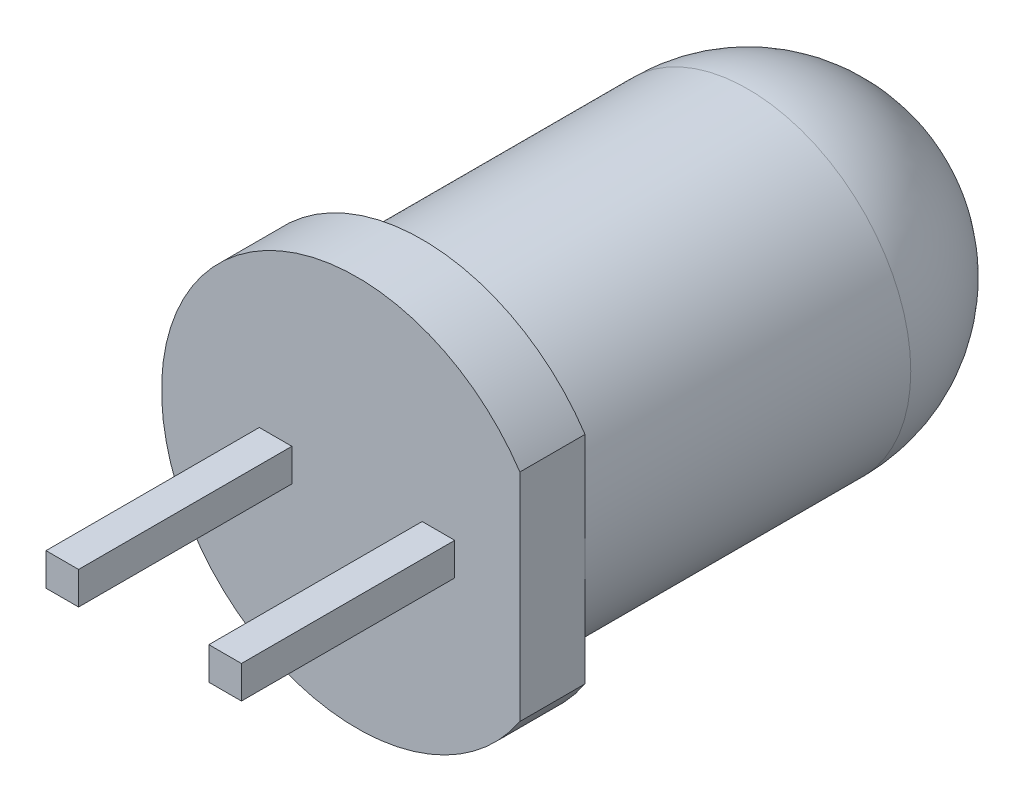
ISO-10303-21;
HEADER;
FILE_DESCRIPTION(('STEP AP214'),'2;1');
FILE_NAME('part.step','',(''),(''),'','','');
FILE_SCHEMA(('AUTOMOTIVE_DESIGN { 1 0 10303 214 1 1 1 1 }'));
ENDSEC;
DATA;
#1=APPLICATION_CONTEXT('core data for automotive mechanical design processes');
#2=APPLICATION_PROTOCOL_DEFINITION('international standard','automotive_design',2000,#1);
#3=PRODUCT_CONTEXT('',#1,'mechanical');
#4=PRODUCT('Part','Part','',(#3));
#5=PRODUCT_RELATED_PRODUCT_CATEGORY('part','',(#4));
#6=PRODUCT_DEFINITION_FORMATION('','',#4);
#7=PRODUCT_DEFINITION_CONTEXT('part definition',#1,'design');
#8=PRODUCT_DEFINITION('design','',#6,#7);
#9=PRODUCT_DEFINITION_SHAPE('','',#8);
#10=(LENGTH_UNIT() NAMED_UNIT(*) SI_UNIT(.MILLI.,.METRE.));
#11=(NAMED_UNIT(*) PLANE_ANGLE_UNIT() SI_UNIT($,.RADIAN.));
#12=(NAMED_UNIT(*) SI_UNIT($,.STERADIAN.) SOLID_ANGLE_UNIT());
#13=UNCERTAINTY_MEASURE_WITH_UNIT(LENGTH_MEASURE(1.E-05),#10,'distance_accuracy_value','');
#14=(GEOMETRIC_REPRESENTATION_CONTEXT(3) GLOBAL_UNCERTAINTY_ASSIGNED_CONTEXT((#13)) GLOBAL_UNIT_ASSIGNED_CONTEXT((#10,
#11,#12)) REPRESENTATION_CONTEXT('',''));
#15=CARTESIAN_POINT('',(0.,0.,0.));
#16=DIRECTION('',(0.,0.,1.));
#17=DIRECTION('',(1.,0.,0.));
#18=AXIS2_PLACEMENT_3D('',#15,#16,#17);
#19=CARTESIAN_POINT('',(0.,0.,-4.77161579796497));
#20=DIRECTION('',(0.,0.,-1.));
#21=DIRECTION('',(-1.,0.,0.));
#22=AXIS2_PLACEMENT_3D('',#19,#20,#21);
#23=SPHERICAL_SURFACE('',#22,2.5);
#24=CARTESIAN_POINT('',(0.,0.,-4.77161579796497));
#25=DIRECTION('',(0.,0.,-1.));
#26=DIRECTION('',(-1.,0.,0.));
#27=AXIS2_PLACEMENT_3D('',#24,#25,#26);
#28=CIRCLE('',#27,2.5);
#29=CARTESIAN_POINT('',(-2.5,0.,-4.77161579796497));
#30=VERTEX_POINT('',#29);
#31=EDGE_CURVE('E154',#30,#30,#28,.T.);
#32=ORIENTED_EDGE('',*,*,#31,.T.);
#33=EDGE_LOOP('',(#32));
#34=FACE_BOUND('',#33,.T.);
#35=ADVANCED_FACE('F32',(#34),#23,.T.);
#36=CARTESIAN_POINT('',(0.,0.,-8.02238805970151));
#37=DIRECTION('',(0.,0.,-1.));
#38=DIRECTION('',(-1.,0.,0.));
#39=AXIS2_PLACEMENT_3D('',#36,#37,#38);
#40=CYLINDRICAL_SURFACE('',#39,2.5);
#41=CARTESIAN_POINT('',(0.,0.,0.228384202035027));
#42=DIRECTION('',(0.,0.,-1.));
#43=DIRECTION('',(-1.,0.,0.));
#44=AXIS2_PLACEMENT_3D('',#41,#42,#43);
#45=CIRCLE('',#44,2.5);
#46=CARTESIAN_POINT('',(2.5,0.,0.228384202035027));
#47=VERTEX_POINT('',#46);
#48=EDGE_CURVE('E151',#47,#47,#45,.T.);
#49=ORIENTED_EDGE('',*,*,#48,.T.);
#50=EDGE_LOOP('',(#49));
#51=FACE_BOUND('',#50,.T.);
#52=ORIENTED_EDGE('',*,*,#31,.F.);
#53=EDGE_LOOP('',(#52));
#54=FACE_BOUND('',#53,.T.);
#55=ADVANCED_FACE('F242',(#51,#54),#40,.T.);
#56=CARTESIAN_POINT('',(-2.5,0.,0.228384202035027));
#57=DIRECTION('',(0.,0.,-1.));
#58=DIRECTION('',(-1.,0.,0.));
#59=AXIS2_PLACEMENT_3D('',#56,#57,#58);
#60=PLANE('',#59);
#61=DIRECTION('',(0.,1.,0.));
#62=VECTOR('',#61,1.);
#63=CARTESIAN_POINT('',(2.5,0.,0.228384202035027));
#64=LINE('',#63,#62);
#65=CARTESIAN_POINT('',(2.5,-1.6583123951777,0.228384202035027));
#66=VERTEX_POINT('',#65);
#67=EDGE_CURVE('E131',#66,#47,#64,.T.);
#68=ORIENTED_EDGE('',*,*,#67,.F.);
#69=CARTESIAN_POINT('',(0.,0.,0.228384202035027));
#70=DIRECTION('',(0.,0.,-1.));
#71=DIRECTION('',(-1.,0.,0.));
#72=AXIS2_PLACEMENT_3D('',#69,#70,#71);
#73=CIRCLE('',#72,3.);
#74=CARTESIAN_POINT('',(2.5,1.6583123951777,0.228384202035027));
#75=VERTEX_POINT('',#74);
#76=EDGE_CURVE('E148',#66,#75,#73,.T.);
#77=ORIENTED_EDGE('',*,*,#76,.T.);
#78=EDGE_CURVE('E215',#47,#75,#64,.T.);
#79=ORIENTED_EDGE('',*,*,#78,.F.);
#80=ORIENTED_EDGE('',*,*,#48,.F.);
#81=EDGE_LOOP('',(#68,#77,#79,#80));
#82=FACE_BOUND('',#81,.T.);
#83=ADVANCED_FACE('F247',(#82),#60,.T.);
#84=CARTESIAN_POINT('',(0.,0.,-8.02238805970151));
#85=DIRECTION('',(0.,0.,-1.));
#86=DIRECTION('',(-1.,0.,0.));
#87=AXIS2_PLACEMENT_3D('',#84,#85,#86);
#88=CYLINDRICAL_SURFACE('',#87,3.);
#89=DIRECTION('',(0.,0.,-1.));
#90=VECTOR('',#89,1.);
#91=CARTESIAN_POINT('',(2.5,1.6583123951777,-8.02238805970151));
#92=LINE('',#91,#90);
#93=CARTESIAN_POINT('',(2.5,1.6583123951777,1.22838420203503));
#94=VERTEX_POINT('',#93);
#95=EDGE_CURVE('E182',#75,#94,#92,.F.);
#96=ORIENTED_EDGE('',*,*,#95,.F.);
#97=ORIENTED_EDGE('',*,*,#76,.F.);
#98=DIRECTION('',(0.,0.,-1.));
#99=VECTOR('',#98,1.);
#100=CARTESIAN_POINT('',(2.5,-1.6583123951777,-8.02238805970151));
#101=LINE('',#100,#99);
#102=CARTESIAN_POINT('',(2.5,-1.6583123951777,1.22838420203503));
#103=VERTEX_POINT('',#102);
#104=EDGE_CURVE('E179',#103,#66,#101,.T.);
#105=ORIENTED_EDGE('',*,*,#104,.F.);
#106=CARTESIAN_POINT('',(0.,0.,1.22838420203503));
#107=DIRECTION('',(0.,0.,-1.));
#108=DIRECTION('',(-1.,0.,0.));
#109=AXIS2_PLACEMENT_3D('',#106,#107,#108);
#110=CIRCLE('',#109,3.);
#111=EDGE_CURVE('E141',#103,#94,#110,.T.);
#112=ORIENTED_EDGE('',*,*,#111,.T.);
#113=EDGE_LOOP('',(#96,#97,#105,#112));
#114=FACE_BOUND('',#113,.T.);
#115=ADVANCED_FACE('F187',(#114),#88,.T.);
#116=CARTESIAN_POINT('',(0.,0.,1.22838420203503));
#117=DIRECTION('',(0.,0.,1.));
#118=DIRECTION('',(1.,0.,0.));
#119=AXIS2_PLACEMENT_3D('',#116,#117,#118);
#120=PLANE('',#119);
#121=DIRECTION('',(0.,-1.,0.));
#122=VECTOR('',#121,1.);
#123=CARTESIAN_POINT('',(2.5,0.,1.22838420203503));
#124=LINE('',#123,#122);
#125=EDGE_CURVE('E39',#94,#103,#124,.T.);
#126=ORIENTED_EDGE('',*,*,#125,.F.);
#127=ORIENTED_EDGE('',*,*,#111,.F.);
#128=EDGE_LOOP('',(#126,#127));
#129=FACE_BOUND('',#128,.T.);
#130=DIRECTION('',(-1.,0.,0.));
#131=VECTOR('',#130,1.);
#132=CARTESIAN_POINT('',(0.,0.25,1.22838420203503));
#133=LINE('',#132,#131);
#134=CARTESIAN_POINT('',(1.5,0.25,1.22838420203503));
#135=VERTEX_POINT('',#134);
#136=CARTESIAN_POINT('',(1.,0.25,1.22838420203503));
#137=VERTEX_POINT('',#136);
#138=EDGE_CURVE('E174',#135,#137,#133,.T.);
#139=ORIENTED_EDGE('',*,*,#138,.F.);
#140=DIRECTION('',(0.,-1.,0.));
#141=VECTOR('',#140,1.);
#142=CARTESIAN_POINT('',(1.5,0.,1.22838420203503));
#143=LINE('',#142,#141);
#144=CARTESIAN_POINT('',(1.5,-0.25,1.22838420203503));
#145=VERTEX_POINT('',#144);
#146=EDGE_CURVE('E169',#135,#145,#143,.T.);
#147=ORIENTED_EDGE('',*,*,#146,.T.);
#148=DIRECTION('',(-1.,0.,0.));
#149=VECTOR('',#148,1.);
#150=CARTESIAN_POINT('',(0.,-0.25,1.22838420203503));
#151=LINE('',#150,#149);
#152=CARTESIAN_POINT('',(1.,-0.25,1.22838420203503));
#153=VERTEX_POINT('',#152);
#154=EDGE_CURVE('E124',#145,#153,#151,.T.);
#155=ORIENTED_EDGE('',*,*,#154,.T.);
#156=DIRECTION('',(0.,1.,0.));
#157=VECTOR('',#156,1.);
#158=CARTESIAN_POINT('',(1.,0.,1.22838420203503));
#159=LINE('',#158,#157);
#160=EDGE_CURVE('E171',#153,#137,#159,.T.);
#161=ORIENTED_EDGE('',*,*,#160,.T.);
#162=EDGE_LOOP('',(#139,#147,#155,#161));
#163=FACE_BOUND('',#162,.T.);
#164=DIRECTION('',(-1.,0.,0.));
#165=VECTOR('',#164,1.);
#166=CARTESIAN_POINT('',(0.,0.25,1.22838420203503));
#167=LINE('',#166,#165);
#168=CARTESIAN_POINT('',(-1.,0.25,1.22838420203503));
#169=VERTEX_POINT('',#168);
#170=CARTESIAN_POINT('',(-1.5,0.25,1.22838420203503));
#171=VERTEX_POINT('',#170);
#172=EDGE_CURVE('E166',#169,#171,#167,.T.);
#173=ORIENTED_EDGE('',*,*,#172,.F.);
#174=DIRECTION('',(0.,-1.,0.));
#175=VECTOR('',#174,1.);
#176=CARTESIAN_POINT('',(-1.,0.,1.22838420203503));
#177=LINE('',#176,#175);
#178=CARTESIAN_POINT('',(-1.,-0.25,1.22838420203503));
#179=VERTEX_POINT('',#178);
#180=EDGE_CURVE('E160',#169,#179,#177,.T.);
#181=ORIENTED_EDGE('',*,*,#180,.T.);
#182=DIRECTION('',(-1.,0.,0.));
#183=VECTOR('',#182,1.);
#184=CARTESIAN_POINT('',(0.,-0.25,1.22838420203503));
#185=LINE('',#184,#183);
#186=CARTESIAN_POINT('',(-1.5,-0.25,1.22838420203503));
#187=VERTEX_POINT('',#186);
#188=EDGE_CURVE('E157',#179,#187,#185,.T.);
#189=ORIENTED_EDGE('',*,*,#188,.T.);
#190=DIRECTION('',(0.,1.,0.));
#191=VECTOR('',#190,1.);
#192=CARTESIAN_POINT('',(-1.5,0.,1.22838420203503));
#193=LINE('',#192,#191);
#194=EDGE_CURVE('E163',#187,#171,#193,.T.);
#195=ORIENTED_EDGE('',*,*,#194,.T.);
#196=EDGE_LOOP('',(#173,#181,#189,#195));
#197=FACE_BOUND('',#196,.T.);
#198=ADVANCED_FACE('F190',(#129,#163,#197),#120,.T.);
#199=CARTESIAN_POINT('',(-1.5,0.25,0.228384202035026));
#200=DIRECTION('',(1.,0.,0.));
#201=DIRECTION('',(0.,0.,-1.));
#202=AXIS2_PLACEMENT_3D('',#199,#200,#201);
#203=PLANE('',#202);
#204=DIRECTION('',(0.,0.,1.));
#205=VECTOR('',#204,1.);
#206=CARTESIAN_POINT('',(-1.5,-0.25,0.228384202035026));
#207=LINE('',#206,#205);
#208=CARTESIAN_POINT('',(-1.5,-0.25,4.50232179039273));
#209=VERTEX_POINT('',#208);
#210=EDGE_CURVE('E142',#187,#209,#207,.T.);
#211=ORIENTED_EDGE('',*,*,#210,.T.);
#212=DIRECTION('',(0.,1.,0.));
#213=VECTOR('',#212,1.);
#214=CARTESIAN_POINT('',(-1.5,0.25,4.50232179039273));
#215=LINE('',#214,#213);
#216=CARTESIAN_POINT('',(-1.5,0.25,4.50232179039273));
#217=VERTEX_POINT('',#216);
#218=EDGE_CURVE('E46',#209,#217,#215,.T.);
#219=ORIENTED_EDGE('',*,*,#218,.T.);
#220=DIRECTION('',(0.,0.,1.));
#221=VECTOR('',#220,1.);
#222=CARTESIAN_POINT('',(-1.5,0.25,0.228384202035026));
#223=LINE('',#222,#221);
#224=EDGE_CURVE('E135',#171,#217,#223,.T.);
#225=ORIENTED_EDGE('',*,*,#224,.F.);
#226=ORIENTED_EDGE('',*,*,#194,.F.);
#227=EDGE_LOOP('',(#211,#219,#225,#226));
#228=FACE_BOUND('',#227,.T.);
#229=ADVANCED_FACE('F193',(#228),#203,.F.);
#230=CARTESIAN_POINT('',(-1.,0.25,0.228384202035026));
#231=DIRECTION('',(-1.,0.,0.));
#232=DIRECTION('',(0.,0.,1.));
#233=AXIS2_PLACEMENT_3D('',#230,#231,#232);
#234=PLANE('',#233);
#235=DIRECTION('',(0.,0.,-1.));
#236=VECTOR('',#235,1.);
#237=CARTESIAN_POINT('',(-1.,0.25,0.228384202035026));
#238=LINE('',#237,#236);
#239=CARTESIAN_POINT('',(-0.999999999999999,0.25,4.50232179039273));
#240=VERTEX_POINT('',#239);
#241=EDGE_CURVE('E138',#240,#169,#238,.T.);
#242=ORIENTED_EDGE('',*,*,#241,.F.);
#243=DIRECTION('',(0.,-1.,0.));
#244=VECTOR('',#243,1.);
#245=CARTESIAN_POINT('',(-0.999999999999999,0.25,4.50232179039273));
#246=LINE('',#245,#244);
#247=CARTESIAN_POINT('',(-0.999999999999996,-0.25,4.50232179039273));
#248=VERTEX_POINT('',#247);
#249=EDGE_CURVE('E206',#240,#248,#246,.T.);
#250=ORIENTED_EDGE('',*,*,#249,.T.);
#251=DIRECTION('',(0.,0.,-1.));
#252=VECTOR('',#251,1.);
#253=CARTESIAN_POINT('',(-1.,-0.25,0.228384202035026));
#254=LINE('',#253,#252);
#255=EDGE_CURVE('E139',#248,#179,#254,.T.);
#256=ORIENTED_EDGE('',*,*,#255,.T.);
#257=ORIENTED_EDGE('',*,*,#180,.F.);
#258=EDGE_LOOP('',(#242,#250,#256,#257));
#259=FACE_BOUND('',#258,.T.);
#260=ADVANCED_FACE('F231',(#259),#234,.F.);
#261=CARTESIAN_POINT('',(0.,0.25,0.));
#262=DIRECTION('',(0.,1.,0.));
#263=DIRECTION('',(0.,0.,1.));
#264=AXIS2_PLACEMENT_3D('',#261,#262,#263);
#265=PLANE('',#264);
#266=DIRECTION('',(-1.,0.,0.));
#267=VECTOR('',#266,1.);
#268=CARTESIAN_POINT('',(0.,0.25,4.50232179039273));
#269=LINE('',#268,#267);
#270=EDGE_CURVE('E188',#240,#217,#269,.T.);
#271=ORIENTED_EDGE('',*,*,#270,.F.);
#272=ORIENTED_EDGE('',*,*,#241,.T.);
#273=ORIENTED_EDGE('',*,*,#172,.T.);
#274=ORIENTED_EDGE('',*,*,#224,.T.);
#275=EDGE_LOOP('',(#271,#272,#273,#274));
#276=FACE_BOUND('',#275,.T.);
#277=ADVANCED_FACE('F203',(#276),#265,.T.);
#278=CARTESIAN_POINT('',(0.,-0.25,0.));
#279=DIRECTION('',(0.,1.,0.));
#280=DIRECTION('',(0.,0.,1.));
#281=AXIS2_PLACEMENT_3D('',#278,#279,#280);
#282=PLANE('',#281);
#283=ORIENTED_EDGE('',*,*,#255,.F.);
#284=DIRECTION('',(-1.,0.,0.));
#285=VECTOR('',#284,1.);
#286=CARTESIAN_POINT('',(0.,-0.25,4.50232179039273));
#287=LINE('',#286,#285);
#288=EDGE_CURVE('E210',#248,#209,#287,.T.);
#289=ORIENTED_EDGE('',*,*,#288,.T.);
#290=ORIENTED_EDGE('',*,*,#210,.F.);
#291=ORIENTED_EDGE('',*,*,#188,.F.);
#292=EDGE_LOOP('',(#283,#289,#290,#291));
#293=FACE_BOUND('',#292,.T.);
#294=ADVANCED_FACE('F227',(#293),#282,.F.);
#295=CARTESIAN_POINT('',(1.,0.25,0.228384202035026));
#296=DIRECTION('',(1.,0.,0.));
#297=DIRECTION('',(0.,0.,-1.));
#298=AXIS2_PLACEMENT_3D('',#295,#296,#297);
#299=PLANE('',#298);
#300=DIRECTION('',(0.,0.,1.));
#301=VECTOR('',#300,1.);
#302=CARTESIAN_POINT('',(1.,-0.25,0.228384202035026));
#303=LINE('',#302,#301);
#304=CARTESIAN_POINT('',(1.,-0.25,4.50232179039273));
#305=VERTEX_POINT('',#304);
#306=EDGE_CURVE('E127',#153,#305,#303,.T.);
#307=ORIENTED_EDGE('',*,*,#306,.T.);
#308=DIRECTION('',(0.,1.,0.));
#309=VECTOR('',#308,1.);
#310=CARTESIAN_POINT('',(1.,0.25,4.50232179039273));
#311=LINE('',#310,#309);
#312=CARTESIAN_POINT('',(1.,0.25,4.50232179039273));
#313=VERTEX_POINT('',#312);
#314=EDGE_CURVE('E54',#305,#313,#311,.T.);
#315=ORIENTED_EDGE('',*,*,#314,.T.);
#316=DIRECTION('',(0.,0.,1.));
#317=VECTOR('',#316,1.);
#318=CARTESIAN_POINT('',(1.,0.25,0.228384202035026));
#319=LINE('',#318,#317);
#320=EDGE_CURVE('E126',#137,#313,#319,.T.);
#321=ORIENTED_EDGE('',*,*,#320,.F.);
#322=ORIENTED_EDGE('',*,*,#160,.F.);
#323=EDGE_LOOP('',(#307,#315,#321,#322));
#324=FACE_BOUND('',#323,.T.);
#325=ADVANCED_FACE('F222',(#324),#299,.F.);
#326=CARTESIAN_POINT('',(1.5,0.25,0.228384202035026));
#327=DIRECTION('',(-1.,0.,0.));
#328=DIRECTION('',(0.,0.,1.));
#329=AXIS2_PLACEMENT_3D('',#326,#327,#328);
#330=PLANE('',#329);
#331=DIRECTION('',(0.,0.,-1.));
#332=VECTOR('',#331,1.);
#333=CARTESIAN_POINT('',(1.5,0.25,0.228384202035026));
#334=LINE('',#333,#332);
#335=CARTESIAN_POINT('',(1.5,0.25,4.50232179039273));
#336=VERTEX_POINT('',#335);
#337=EDGE_CURVE('E120',#336,#135,#334,.T.);
#338=ORIENTED_EDGE('',*,*,#337,.F.);
#339=DIRECTION('',(0.,-1.,0.));
#340=VECTOR('',#339,1.);
#341=CARTESIAN_POINT('',(1.5,0.25,4.50232179039273));
#342=LINE('',#341,#340);
#343=CARTESIAN_POINT('',(1.5,-0.25,4.50232179039273));
#344=VERTEX_POINT('',#343);
#345=EDGE_CURVE('E109',#336,#344,#342,.T.);
#346=ORIENTED_EDGE('',*,*,#345,.T.);
#347=DIRECTION('',(0.,0.,-1.));
#348=VECTOR('',#347,1.);
#349=CARTESIAN_POINT('',(1.5,-0.25,0.228384202035026));
#350=LINE('',#349,#348);
#351=EDGE_CURVE('E118',#344,#145,#350,.T.);
#352=ORIENTED_EDGE('',*,*,#351,.T.);
#353=ORIENTED_EDGE('',*,*,#146,.F.);
#354=EDGE_LOOP('',(#338,#346,#352,#353));
#355=FACE_BOUND('',#354,.T.);
#356=ADVANCED_FACE('F116',(#355),#330,.F.);
#357=CARTESIAN_POINT('',(0.,0.25,0.));
#358=DIRECTION('',(0.,1.,0.));
#359=DIRECTION('',(0.,0.,1.));
#360=AXIS2_PLACEMENT_3D('',#357,#358,#359);
#361=PLANE('',#360);
#362=DIRECTION('',(-1.,0.,0.));
#363=VECTOR('',#362,1.);
#364=CARTESIAN_POINT('',(0.,0.25,4.50232179039273));
#365=LINE('',#364,#363);
#366=EDGE_CURVE('E219',#336,#313,#365,.T.);
#367=ORIENTED_EDGE('',*,*,#366,.F.);
#368=ORIENTED_EDGE('',*,*,#337,.T.);
#369=ORIENTED_EDGE('',*,*,#138,.T.);
#370=ORIENTED_EDGE('',*,*,#320,.T.);
#371=EDGE_LOOP('',(#367,#368,#369,#370));
#372=FACE_BOUND('',#371,.T.);
#373=ADVANCED_FACE('F217',(#372),#361,.T.);
#374=CARTESIAN_POINT('',(0.,-0.25,0.));
#375=DIRECTION('',(0.,1.,0.));
#376=DIRECTION('',(0.,0.,1.));
#377=AXIS2_PLACEMENT_3D('',#374,#375,#376);
#378=PLANE('',#377);
#379=ORIENTED_EDGE('',*,*,#351,.F.);
#380=DIRECTION('',(-1.,0.,0.));
#381=VECTOR('',#380,1.);
#382=CARTESIAN_POINT('',(0.,-0.25,4.50232179039273));
#383=LINE('',#382,#381);
#384=EDGE_CURVE('E11',#344,#305,#383,.T.);
#385=ORIENTED_EDGE('',*,*,#384,.T.);
#386=ORIENTED_EDGE('',*,*,#306,.F.);
#387=ORIENTED_EDGE('',*,*,#154,.F.);
#388=EDGE_LOOP('',(#379,#385,#386,#387));
#389=FACE_BOUND('',#388,.T.);
#390=ADVANCED_FACE('F122',(#389),#378,.F.);
#391=CARTESIAN_POINT('',(2.5,-2.5,-5.04237698122616));
#392=DIRECTION('',(-1.,0.,0.));
#393=DIRECTION('',(0.,0.,1.));
#394=AXIS2_PLACEMENT_3D('',#391,#392,#393);
#395=PLANE('',#394);
#396=ORIENTED_EDGE('',*,*,#67,.T.);
#397=ORIENTED_EDGE('',*,*,#78,.T.);
#398=ORIENTED_EDGE('',*,*,#95,.T.);
#399=ORIENTED_EDGE('',*,*,#125,.T.);
#400=ORIENTED_EDGE('',*,*,#104,.T.);
#401=EDGE_LOOP('',(#396,#397,#398,#399,#400));
#402=FACE_BOUND('',#401,.T.);
#403=ADVANCED_FACE('F178',(#402),#395,.F.);
#404=CARTESIAN_POINT('',(-7.74859858190161,-3.,4.50232179039273));
#405=DIRECTION('',(0.,0.,-1.));
#406=DIRECTION('',(-1.,0.,0.));
#407=AXIS2_PLACEMENT_3D('',#404,#405,#406);
#408=PLANE('',#407);
#409=ORIENTED_EDGE('',*,*,#366,.T.);
#410=ORIENTED_EDGE('',*,*,#314,.F.);
#411=ORIENTED_EDGE('',*,*,#384,.F.);
#412=ORIENTED_EDGE('',*,*,#345,.F.);
#413=EDGE_LOOP('',(#409,#410,#411,#412));
#414=FACE_BOUND('',#413,.T.);
#415=ADVANCED_FACE('F108',(#414),#408,.F.);
#416=ORIENTED_EDGE('',*,*,#270,.T.);
#417=ORIENTED_EDGE('',*,*,#218,.F.);
#418=ORIENTED_EDGE('',*,*,#288,.F.);
#419=ORIENTED_EDGE('',*,*,#249,.F.);
#420=EDGE_LOOP('',(#416,#417,#418,#419));
#421=FACE_BOUND('',#420,.T.);
#422=ADVANCED_FACE('F229',(#421),#408,.F.);
#423=CLOSED_SHELL('',(#35,#55,#83,#115,#198,#229,#260,#277,#294,#325,#356,#373,#390,#403,#415,#422));
#424=MANIFOLD_SOLID_BREP('B2',#423);
#425=ADVANCED_BREP_SHAPE_REPRESENTATION('',(#18,#424),#14);
#426=SHAPE_DEFINITION_REPRESENTATION(#9,#425);
ENDSEC;
END-ISO-10303-21;
